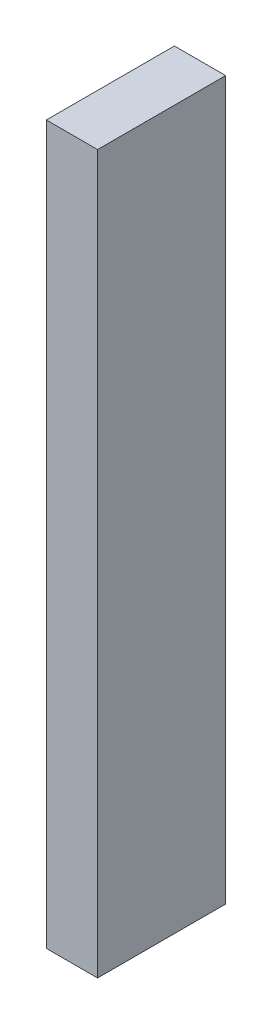
ISO-10303-21;
HEADER;
FILE_DESCRIPTION(('STEP AP214'),'2;1');
FILE_NAME('part.step','',(''),(''),'','','');
FILE_SCHEMA(('AUTOMOTIVE_DESIGN { 1 0 10303 214 1 1 1 1 }'));
ENDSEC;
DATA;
#1=APPLICATION_CONTEXT('core data for automotive mechanical design processes');
#2=APPLICATION_PROTOCOL_DEFINITION('international standard','automotive_design',2000,#1);
#3=PRODUCT_CONTEXT('',#1,'mechanical');
#4=PRODUCT('Part','Part','',(#3));
#5=PRODUCT_RELATED_PRODUCT_CATEGORY('part','',(#4));
#6=PRODUCT_DEFINITION_FORMATION('','',#4);
#7=PRODUCT_DEFINITION_CONTEXT('part definition',#1,'design');
#8=PRODUCT_DEFINITION('design','',#6,#7);
#9=PRODUCT_DEFINITION_SHAPE('','',#8);
#10=(LENGTH_UNIT() NAMED_UNIT(*) SI_UNIT(.MILLI.,.METRE.));
#11=(NAMED_UNIT(*) PLANE_ANGLE_UNIT() SI_UNIT($,.RADIAN.));
#12=(NAMED_UNIT(*) SI_UNIT($,.STERADIAN.) SOLID_ANGLE_UNIT());
#13=UNCERTAINTY_MEASURE_WITH_UNIT(LENGTH_MEASURE(1.E-05),#10,'distance_accuracy_value','');
#14=(GEOMETRIC_REPRESENTATION_CONTEXT(3) GLOBAL_UNCERTAINTY_ASSIGNED_CONTEXT((#13)) GLOBAL_UNIT_ASSIGNED_CONTEXT((#10,
#11,#12)) REPRESENTATION_CONTEXT('',''));
#15=CARTESIAN_POINT('',(0.,0.,0.));
#16=DIRECTION('',(0.,0.,1.));
#17=DIRECTION('',(1.,0.,0.));
#18=AXIS2_PLACEMENT_3D('',#15,#16,#17);
#19=CARTESIAN_POINT('',(0.,355.6,0.));
#20=DIRECTION('',(1.,0.,0.));
#21=DIRECTION('',(0.,0.,-1.));
#22=AXIS2_PLACEMENT_3D('',#19,#20,#21);
#23=PLANE('',#22);
#24=DIRECTION('',(0.,0.,1.));
#25=VECTOR('',#24,1.);
#26=CARTESIAN_POINT('',(0.,0.,0.));
#27=LINE('',#26,#25);
#28=CARTESIAN_POINT('',(0.,0.,-63.5));
#29=VERTEX_POINT('',#28);
#30=CARTESIAN_POINT('',(0.,0.,0.));
#31=VERTEX_POINT('',#30);
#32=EDGE_CURVE('E96',#29,#31,#27,.T.);
#33=ORIENTED_EDGE('',*,*,#32,.T.);
#34=DIRECTION('',(0.,-1.,0.));
#35=VECTOR('',#34,1.);
#36=CARTESIAN_POINT('',(0.,355.6,0.));
#37=LINE('',#36,#35);
#38=CARTESIAN_POINT('',(0.,355.6,0.));
#39=VERTEX_POINT('',#38);
#40=EDGE_CURVE('E11',#39,#31,#37,.T.);
#41=ORIENTED_EDGE('',*,*,#40,.F.);
#42=DIRECTION('',(0.,0.,1.));
#43=VECTOR('',#42,1.);
#44=CARTESIAN_POINT('',(0.,355.6,0.));
#45=LINE('',#44,#43);
#46=CARTESIAN_POINT('',(0.,355.6,-63.5));
#47=VERTEX_POINT('',#46);
#48=EDGE_CURVE('E84',#47,#39,#45,.T.);
#49=ORIENTED_EDGE('',*,*,#48,.F.);
#50=DIRECTION('',(0.,-1.,0.));
#51=VECTOR('',#50,1.);
#52=CARTESIAN_POINT('',(0.,355.6,-63.5));
#53=LINE('',#52,#51);
#54=EDGE_CURVE('E92',#47,#29,#53,.T.);
#55=ORIENTED_EDGE('',*,*,#54,.T.);
#56=EDGE_LOOP('',(#33,#41,#49,#55));
#57=FACE_BOUND('',#56,.T.);
#58=ADVANCED_FACE('F33',(#57),#23,.F.);
#59=CARTESIAN_POINT('',(0.,355.6,0.));
#60=DIRECTION('',(0.,0.,-1.));
#61=DIRECTION('',(-1.,0.,0.));
#62=AXIS2_PLACEMENT_3D('',#59,#60,#61);
#63=PLANE('',#62);
#64=DIRECTION('',(1.,0.,0.));
#65=VECTOR('',#64,1.);
#66=CARTESIAN_POINT('',(0.,0.,0.));
#67=LINE('',#66,#65);
#68=CARTESIAN_POINT('',(25.4,0.,0.));
#69=VERTEX_POINT('',#68);
#70=EDGE_CURVE('E88',#31,#69,#67,.T.);
#71=ORIENTED_EDGE('',*,*,#70,.T.);
#72=DIRECTION('',(0.,-1.,0.));
#73=VECTOR('',#72,1.);
#74=CARTESIAN_POINT('',(25.4,355.6,0.));
#75=LINE('',#74,#73);
#76=CARTESIAN_POINT('',(25.4,355.6,0.));
#77=VERTEX_POINT('',#76);
#78=EDGE_CURVE('E41',#77,#69,#75,.T.);
#79=ORIENTED_EDGE('',*,*,#78,.F.);
#80=DIRECTION('',(1.,0.,0.));
#81=VECTOR('',#80,1.);
#82=CARTESIAN_POINT('',(0.,355.6,0.));
#83=LINE('',#82,#81);
#84=EDGE_CURVE('E79',#39,#77,#83,.T.);
#85=ORIENTED_EDGE('',*,*,#84,.F.);
#86=ORIENTED_EDGE('',*,*,#40,.T.);
#87=EDGE_LOOP('',(#71,#79,#85,#86));
#88=FACE_BOUND('',#87,.T.);
#89=ADVANCED_FACE('F87',(#88),#63,.F.);
#90=CARTESIAN_POINT('',(25.4,355.6,0.));
#91=DIRECTION('',(-1.,0.,0.));
#92=DIRECTION('',(0.,0.,1.));
#93=AXIS2_PLACEMENT_3D('',#90,#91,#92);
#94=PLANE('',#93);
#95=DIRECTION('',(0.,0.,-1.));
#96=VECTOR('',#95,1.);
#97=CARTESIAN_POINT('',(25.4,0.,0.));
#98=LINE('',#97,#96);
#99=CARTESIAN_POINT('',(25.4,0.,-63.5));
#100=VERTEX_POINT('',#99);
#101=EDGE_CURVE('E66',#69,#100,#98,.T.);
#102=ORIENTED_EDGE('',*,*,#101,.T.);
#103=DIRECTION('',(0.,-1.,0.));
#104=VECTOR('',#103,1.);
#105=CARTESIAN_POINT('',(25.4,355.6,-63.5));
#106=LINE('',#105,#104);
#107=CARTESIAN_POINT('',(25.4,355.6,-63.5));
#108=VERTEX_POINT('',#107);
#109=EDGE_CURVE('E89',#108,#100,#106,.T.);
#110=ORIENTED_EDGE('',*,*,#109,.F.);
#111=DIRECTION('',(0.,0.,-1.));
#112=VECTOR('',#111,1.);
#113=CARTESIAN_POINT('',(25.4,355.6,0.));
#114=LINE('',#113,#112);
#115=EDGE_CURVE('E82',#77,#108,#114,.T.);
#116=ORIENTED_EDGE('',*,*,#115,.F.);
#117=ORIENTED_EDGE('',*,*,#78,.T.);
#118=EDGE_LOOP('',(#102,#110,#116,#117));
#119=FACE_BOUND('',#118,.T.);
#120=ADVANCED_FACE('F90',(#119),#94,.F.);
#121=CARTESIAN_POINT('',(0.,355.6,-63.5));
#122=DIRECTION('',(0.,0.,1.));
#123=DIRECTION('',(1.,0.,0.));
#124=AXIS2_PLACEMENT_3D('',#121,#122,#123);
#125=PLANE('',#124);
#126=DIRECTION('',(-1.,0.,0.));
#127=VECTOR('',#126,1.);
#128=CARTESIAN_POINT('',(0.,0.,-63.5));
#129=LINE('',#128,#127);
#130=EDGE_CURVE('E72',#100,#29,#129,.T.);
#131=ORIENTED_EDGE('',*,*,#130,.T.);
#132=ORIENTED_EDGE('',*,*,#54,.F.);
#133=DIRECTION('',(-1.,0.,0.));
#134=VECTOR('',#133,1.);
#135=CARTESIAN_POINT('',(0.,355.6,-63.5));
#136=LINE('',#135,#134);
#137=EDGE_CURVE('E49',#108,#47,#136,.T.);
#138=ORIENTED_EDGE('',*,*,#137,.F.);
#139=ORIENTED_EDGE('',*,*,#109,.T.);
#140=EDGE_LOOP('',(#131,#132,#138,#139));
#141=FACE_BOUND('',#140,.T.);
#142=ADVANCED_FACE('F103',(#141),#125,.F.);
#143=CARTESIAN_POINT('',(0.,355.6,0.));
#144=DIRECTION('',(0.,-1.,0.));
#145=DIRECTION('',(0.,0.,-1.));
#146=AXIS2_PLACEMENT_3D('',#143,#144,#145);
#147=PLANE('',#146);
#148=ORIENTED_EDGE('',*,*,#48,.T.);
#149=ORIENTED_EDGE('',*,*,#84,.T.);
#150=ORIENTED_EDGE('',*,*,#115,.T.);
#151=ORIENTED_EDGE('',*,*,#137,.T.);
#152=EDGE_LOOP('',(#148,#149,#150,#151));
#153=FACE_BOUND('',#152,.T.);
#154=ADVANCED_FACE('F80',(#153),#147,.F.);
#155=CARTESIAN_POINT('',(0.,0.,0.));
#156=DIRECTION('',(0.,-1.,0.));
#157=DIRECTION('',(0.,0.,-1.));
#158=AXIS2_PLACEMENT_3D('',#155,#156,#157);
#159=PLANE('',#158);
#160=ORIENTED_EDGE('',*,*,#32,.F.);
#161=ORIENTED_EDGE('',*,*,#130,.F.);
#162=ORIENTED_EDGE('',*,*,#101,.F.);
#163=ORIENTED_EDGE('',*,*,#70,.F.);
#164=EDGE_LOOP('',(#160,#161,#162,#163));
#165=FACE_BOUND('',#164,.T.);
#166=ADVANCED_FACE('F106',(#165),#159,.T.);
#167=CLOSED_SHELL('',(#58,#89,#120,#142,#154,#166));
#168=MANIFOLD_SOLID_BREP('B2',#167);
#169=ADVANCED_BREP_SHAPE_REPRESENTATION('',(#18,#168),#14);
#170=SHAPE_DEFINITION_REPRESENTATION(#9,#169);
ENDSEC;
END-ISO-10303-21;
